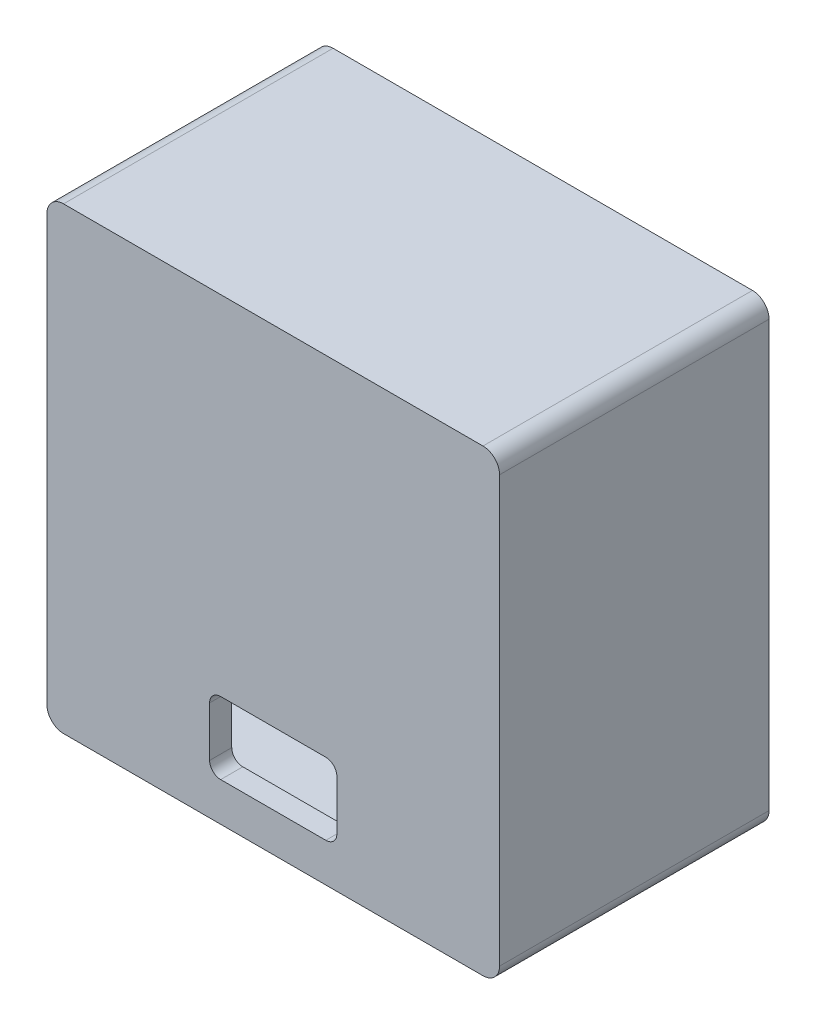
ISO-10303-21;
HEADER;
FILE_DESCRIPTION(('STEP AP214'),'2;1');
FILE_NAME('part.step','',(''),(''),'','','');
FILE_SCHEMA(('AUTOMOTIVE_DESIGN { 1 0 10303 214 1 1 1 1 }'));
ENDSEC;
DATA;
#1=APPLICATION_CONTEXT('core data for automotive mechanical design processes');
#2=APPLICATION_PROTOCOL_DEFINITION('international standard','automotive_design',2000,#1);
#3=PRODUCT_CONTEXT('',#1,'mechanical');
#4=PRODUCT('Part','Part','',(#3));
#5=PRODUCT_RELATED_PRODUCT_CATEGORY('part','',(#4));
#6=PRODUCT_DEFINITION_FORMATION('','',#4);
#7=PRODUCT_DEFINITION_CONTEXT('part definition',#1,'design');
#8=PRODUCT_DEFINITION('design','',#6,#7);
#9=PRODUCT_DEFINITION_SHAPE('','',#8);
#10=(LENGTH_UNIT() NAMED_UNIT(*) SI_UNIT(.MILLI.,.METRE.));
#11=(NAMED_UNIT(*) PLANE_ANGLE_UNIT() SI_UNIT($,.RADIAN.));
#12=(NAMED_UNIT(*) SI_UNIT($,.STERADIAN.) SOLID_ANGLE_UNIT());
#13=UNCERTAINTY_MEASURE_WITH_UNIT(LENGTH_MEASURE(1.E-05),#10,'distance_accuracy_value','');
#14=(GEOMETRIC_REPRESENTATION_CONTEXT(3) GLOBAL_UNCERTAINTY_ASSIGNED_CONTEXT((#13)) GLOBAL_UNIT_ASSIGNED_CONTEXT((#10,
#11,#12)) REPRESENTATION_CONTEXT('',''));
#15=CARTESIAN_POINT('',(0.,0.,0.));
#16=DIRECTION('',(0.,0.,1.));
#17=DIRECTION('',(1.,0.,0.));
#18=AXIS2_PLACEMENT_3D('',#15,#16,#17);
#19=CARTESIAN_POINT('',(0.,0.,80.));
#20=DIRECTION('',(0.,0.,1.));
#21=DIRECTION('',(1.,0.,0.));
#22=AXIS2_PLACEMENT_3D('',#19,#20,#21);
#23=PLANE('',#22);
#24=DIRECTION('',(0.,-1.,0.));
#25=VECTOR('',#24,1.);
#26=CARTESIAN_POINT('',(39.0435,38.599,80.));
#27=LINE('',#26,#25);
#28=CARTESIAN_POINT('',(39.0435,38.599,80.));
#29=VERTEX_POINT('',#28);
#30=CARTESIAN_POINT('',(39.0435,-38.599,80.));
#31=VERTEX_POINT('',#30);
#32=EDGE_CURVE('E240',#29,#31,#27,.T.);
#33=ORIENTED_EDGE('',*,*,#32,.F.);
#34=DIRECTION('',(1.,0.,0.));
#35=VECTOR('',#34,1.);
#36=CARTESIAN_POINT('',(-39.0435,38.599,80.));
#37=LINE('',#36,#35);
#38=CARTESIAN_POINT('',(-39.0435,38.599,80.));
#39=VERTEX_POINT('',#38);
#40=EDGE_CURVE('E211',#39,#29,#37,.T.);
#41=ORIENTED_EDGE('',*,*,#40,.F.);
#42=DIRECTION('',(0.,1.,0.));
#43=VECTOR('',#42,1.);
#44=CARTESIAN_POINT('',(-39.0435,-38.599,80.));
#45=LINE('',#44,#43);
#46=CARTESIAN_POINT('',(-39.0435,-38.599,80.));
#47=VERTEX_POINT('',#46);
#48=EDGE_CURVE('E228',#47,#39,#45,.T.);
#49=ORIENTED_EDGE('',*,*,#48,.F.);
#50=DIRECTION('',(-1.,0.,0.));
#51=VECTOR('',#50,1.);
#52=CARTESIAN_POINT('',(39.0435,-38.599,80.));
#53=LINE('',#52,#51);
#54=EDGE_CURVE('E231',#31,#47,#53,.T.);
#55=ORIENTED_EDGE('',*,*,#54,.F.);
#56=EDGE_LOOP('',(#33,#41,#49,#55));
#57=FACE_BOUND('',#56,.T.);
#58=CARTESIAN_POINT('',(-37.8935,37.449,80.));
#59=DIRECTION('',(0.,0.,1.));
#60=DIRECTION('',(1.,0.,0.));
#61=AXIS2_PLACEMENT_3D('',#58,#59,#60);
#62=CIRCLE('',#61,3.);
#63=CARTESIAN_POINT('',(-40.8935,37.449,80.));
#64=VERTEX_POINT('',#63);
#65=CARTESIAN_POINT('',(-37.8935,40.449,80.));
#66=VERTEX_POINT('',#65);
#67=EDGE_CURVE('E343',#64,#66,#62,.F.);
#68=ORIENTED_EDGE('',*,*,#67,.T.);
#69=DIRECTION('',(-1.,0.,0.));
#70=VECTOR('',#69,1.);
#71=CARTESIAN_POINT('',(-36.8935,40.449,80.));
#72=LINE('',#71,#70);
#73=CARTESIAN_POINT('',(37.8935,40.449,80.));
#74=VERTEX_POINT('',#73);
#75=EDGE_CURVE('E344',#74,#66,#72,.T.);
#76=ORIENTED_EDGE('',*,*,#75,.F.);
#77=CARTESIAN_POINT('',(37.8935,37.449,80.));
#78=DIRECTION('',(0.,0.,1.));
#79=DIRECTION('',(1.,0.,0.));
#80=AXIS2_PLACEMENT_3D('',#77,#78,#79);
#81=CIRCLE('',#80,3.);
#82=CARTESIAN_POINT('',(40.8935,37.449,80.));
#83=VERTEX_POINT('',#82);
#84=EDGE_CURVE('E339',#74,#83,#81,.F.);
#85=ORIENTED_EDGE('',*,*,#84,.T.);
#86=DIRECTION('',(0.,1.,0.));
#87=VECTOR('',#86,1.);
#88=CARTESIAN_POINT('',(40.8935,36.449,80.));
#89=LINE('',#88,#87);
#90=CARTESIAN_POINT('',(40.8935,-39.449,80.));
#91=VERTEX_POINT('',#90);
#92=EDGE_CURVE('E334',#91,#83,#89,.T.);
#93=ORIENTED_EDGE('',*,*,#92,.F.);
#94=CARTESIAN_POINT('',(37.8935,-39.449,80.));
#95=DIRECTION('',(0.,0.,1.));
#96=DIRECTION('',(1.,0.,0.));
#97=AXIS2_PLACEMENT_3D('',#94,#95,#96);
#98=CIRCLE('',#97,3.);
#99=CARTESIAN_POINT('',(37.8935,-42.449,80.));
#100=VERTEX_POINT('',#99);
#101=EDGE_CURVE('E335',#91,#100,#98,.F.);
#102=ORIENTED_EDGE('',*,*,#101,.T.);
#103=DIRECTION('',(-1.,0.,0.));
#104=VECTOR('',#103,1.);
#105=CARTESIAN_POINT('',(0.,-42.449,80.));
#106=LINE('',#105,#104);
#107=CARTESIAN_POINT('',(-37.8935,-42.449,80.));
#108=VERTEX_POINT('',#107);
#109=EDGE_CURVE('E340',#100,#108,#106,.T.);
#110=ORIENTED_EDGE('',*,*,#109,.T.);
#111=CARTESIAN_POINT('',(-37.8935,-39.449,80.));
#112=DIRECTION('',(0.,0.,1.));
#113=DIRECTION('',(1.,0.,0.));
#114=AXIS2_PLACEMENT_3D('',#111,#112,#113);
#115=CIRCLE('',#114,3.);
#116=CARTESIAN_POINT('',(-40.8935,-39.449,80.));
#117=VERTEX_POINT('',#116);
#118=EDGE_CURVE('E349',#108,#117,#115,.F.);
#119=ORIENTED_EDGE('',*,*,#118,.T.);
#120=DIRECTION('',(0.,-1.,0.));
#121=VECTOR('',#120,1.);
#122=CARTESIAN_POINT('',(-40.8935,36.449,80.));
#123=LINE('',#122,#121);
#124=EDGE_CURVE('E346',#64,#117,#123,.T.);
#125=ORIENTED_EDGE('',*,*,#124,.F.);
#126=EDGE_LOOP('',(#68,#76,#85,#93,#102,#110,#119,#125));
#127=FACE_BOUND('',#126,.T.);
#128=ADVANCED_FACE('F43',(#57,#127),#23,.F.);
#129=CARTESIAN_POINT('',(-36.8935,40.449,123.698));
#130=DIRECTION('',(0.,-1.,0.));
#131=DIRECTION('',(0.,0.,-1.));
#132=AXIS2_PLACEMENT_3D('',#129,#130,#131);
#133=PLANE('',#132);
#134=DIRECTION('',(0.,0.,-1.));
#135=VECTOR('',#134,1.);
#136=CARTESIAN_POINT('',(37.8935,40.449,123.698));
#137=LINE('',#136,#135);
#138=CARTESIAN_POINT('',(37.8935,40.449,128.698));
#139=VERTEX_POINT('',#138);
#140=EDGE_CURVE('E311',#139,#74,#137,.T.);
#141=ORIENTED_EDGE('',*,*,#140,.T.);
#142=ORIENTED_EDGE('',*,*,#75,.T.);
#143=DIRECTION('',(0.,0.,-1.));
#144=VECTOR('',#143,1.);
#145=CARTESIAN_POINT('',(-37.8935,40.449,123.698));
#146=LINE('',#145,#144);
#147=CARTESIAN_POINT('',(-37.8935,40.449,128.698));
#148=VERTEX_POINT('',#147);
#149=EDGE_CURVE('E314',#66,#148,#146,.F.);
#150=ORIENTED_EDGE('',*,*,#149,.T.);
#151=DIRECTION('',(-1.,0.,0.));
#152=VECTOR('',#151,1.);
#153=CARTESIAN_POINT('',(40.8935,40.449,128.698));
#154=LINE('',#153,#152);
#155=EDGE_CURVE('E276',#139,#148,#154,.T.);
#156=ORIENTED_EDGE('',*,*,#155,.F.);
#157=EDGE_LOOP('',(#141,#142,#150,#156));
#158=FACE_BOUND('',#157,.T.);
#159=ADVANCED_FACE('F451',(#158),#133,.F.);
#160=CARTESIAN_POINT('',(-40.8935,36.449,123.698));
#161=DIRECTION('',(1.,0.,0.));
#162=DIRECTION('',(0.,1.,0.));
#163=AXIS2_PLACEMENT_3D('',#160,#161,#162);
#164=PLANE('',#163);
#165=DIRECTION('',(0.,0.,-1.));
#166=VECTOR('',#165,1.);
#167=CARTESIAN_POINT('',(-40.8935,37.449,123.698));
#168=LINE('',#167,#166);
#169=CARTESIAN_POINT('',(-40.8935,37.449,128.698));
#170=VERTEX_POINT('',#169);
#171=EDGE_CURVE('E308',#170,#64,#168,.T.);
#172=ORIENTED_EDGE('',*,*,#171,.T.);
#173=ORIENTED_EDGE('',*,*,#124,.T.);
#174=DIRECTION('',(0.,0.,-1.));
#175=VECTOR('',#174,1.);
#176=CARTESIAN_POINT('',(-40.8935,-39.449,128.698));
#177=LINE('',#176,#175);
#178=CARTESIAN_POINT('',(-40.8935,-39.449,128.698));
#179=VERTEX_POINT('',#178);
#180=EDGE_CURVE('E306',#117,#179,#177,.F.);
#181=ORIENTED_EDGE('',*,*,#180,.T.);
#182=DIRECTION('',(0.,-1.,0.));
#183=VECTOR('',#182,1.);
#184=CARTESIAN_POINT('',(-40.8935,40.449,128.698));
#185=LINE('',#184,#183);
#186=EDGE_CURVE('E279',#170,#179,#185,.T.);
#187=ORIENTED_EDGE('',*,*,#186,.F.);
#188=EDGE_LOOP('',(#172,#173,#181,#187));
#189=FACE_BOUND('',#188,.T.);
#190=ADVANCED_FACE('F460',(#189),#164,.F.);
#191=CARTESIAN_POINT('',(40.8935,36.449,123.698));
#192=DIRECTION('',(-1.,0.,0.));
#193=DIRECTION('',(0.,0.,1.));
#194=AXIS2_PLACEMENT_3D('',#191,#192,#193);
#195=PLANE('',#194);
#196=DIRECTION('',(0.,0.,1.));
#197=VECTOR('',#196,1.);
#198=CARTESIAN_POINT('',(40.8935,-39.449,-4.));
#199=LINE('',#198,#197);
#200=CARTESIAN_POINT('',(40.8935,-39.449,128.698));
#201=VERTEX_POINT('',#200);
#202=EDGE_CURVE('E329',#201,#91,#199,.F.);
#203=ORIENTED_EDGE('',*,*,#202,.T.);
#204=ORIENTED_EDGE('',*,*,#92,.T.);
#205=DIRECTION('',(0.,0.,-1.));
#206=VECTOR('',#205,1.);
#207=CARTESIAN_POINT('',(40.8935,37.449,123.698));
#208=LINE('',#207,#206);
#209=CARTESIAN_POINT('',(40.8935,37.449,128.698));
#210=VERTEX_POINT('',#209);
#211=EDGE_CURVE('E332',#83,#210,#208,.F.);
#212=ORIENTED_EDGE('',*,*,#211,.T.);
#213=DIRECTION('',(0.,1.,0.));
#214=VECTOR('',#213,1.);
#215=CARTESIAN_POINT('',(40.8935,-40.449,128.698));
#216=LINE('',#215,#214);
#217=EDGE_CURVE('E273',#201,#210,#216,.T.);
#218=ORIENTED_EDGE('',*,*,#217,.F.);
#219=EDGE_LOOP('',(#203,#204,#212,#218));
#220=FACE_BOUND('',#219,.T.);
#221=ADVANCED_FACE('F487',(#220),#195,.F.);
#222=CARTESIAN_POINT('',(0.,0.,128.698));
#223=DIRECTION('',(0.,0.,1.));
#224=DIRECTION('',(1.,0.,0.));
#225=AXIS2_PLACEMENT_3D('',#222,#223,#224);
#226=PLANE('',#225);
#227=DIRECTION('',(0.,1.,0.));
#228=VECTOR('',#227,1.);
#229=CARTESIAN_POINT('',(11.5,-22.449,128.698));
#230=LINE('',#229,#228);
#231=CARTESIAN_POINT('',(11.5,-33.449,128.698));
#232=VERTEX_POINT('',#231);
#233=CARTESIAN_POINT('',(11.5,-24.449,128.698));
#234=VERTEX_POINT('',#233);
#235=EDGE_CURVE('E425',#232,#234,#230,.T.);
#236=ORIENTED_EDGE('',*,*,#235,.F.);
#237=CARTESIAN_POINT('',(9.50000000000001,-33.449,128.698));
#238=DIRECTION('',(0.,0.,1.));
#239=DIRECTION('',(1.,0.,0.));
#240=AXIS2_PLACEMENT_3D('',#237,#238,#239);
#241=CIRCLE('',#240,2.);
#242=CARTESIAN_POINT('',(9.50000000000001,-35.449,128.698));
#243=VERTEX_POINT('',#242);
#244=EDGE_CURVE('E395',#232,#243,#241,.F.);
#245=ORIENTED_EDGE('',*,*,#244,.T.);
#246=DIRECTION('',(1.,0.,0.));
#247=VECTOR('',#246,1.);
#248=CARTESIAN_POINT('',(-11.5,-35.449,128.698));
#249=LINE('',#248,#247);
#250=CARTESIAN_POINT('',(-9.49999999999999,-35.449,128.698));
#251=VERTEX_POINT('',#250);
#252=EDGE_CURVE('E234',#251,#243,#249,.T.);
#253=ORIENTED_EDGE('',*,*,#252,.F.);
#254=CARTESIAN_POINT('',(-9.49999999999999,-33.449,128.698));
#255=DIRECTION('',(0.,0.,1.));
#256=DIRECTION('',(1.,0.,0.));
#257=AXIS2_PLACEMENT_3D('',#254,#255,#256);
#258=CIRCLE('',#257,2.);
#259=CARTESIAN_POINT('',(-11.5,-33.449,128.698));
#260=VERTEX_POINT('',#259);
#261=EDGE_CURVE('E51',#251,#260,#258,.F.);
#262=ORIENTED_EDGE('',*,*,#261,.T.);
#263=DIRECTION('',(0.,-1.,0.));
#264=VECTOR('',#263,1.);
#265=CARTESIAN_POINT('',(-11.5,-22.449,128.698));
#266=LINE('',#265,#264);
#267=CARTESIAN_POINT('',(-11.5,-24.449,128.698));
#268=VERTEX_POINT('',#267);
#269=EDGE_CURVE('E405',#268,#260,#266,.T.);
#270=ORIENTED_EDGE('',*,*,#269,.F.);
#271=CARTESIAN_POINT('',(-9.49999999999999,-24.449,128.698));
#272=DIRECTION('',(0.,0.,1.));
#273=DIRECTION('',(1.,0.,0.));
#274=AXIS2_PLACEMENT_3D('',#271,#272,#273);
#275=CIRCLE('',#274,2.);
#276=CARTESIAN_POINT('',(-9.49999999999999,-22.449,128.698));
#277=VERTEX_POINT('',#276);
#278=EDGE_CURVE('E387',#268,#277,#275,.F.);
#279=ORIENTED_EDGE('',*,*,#278,.T.);
#280=DIRECTION('',(-1.,0.,0.));
#281=VECTOR('',#280,1.);
#282=CARTESIAN_POINT('',(-11.5,-22.449,128.698));
#283=LINE('',#282,#281);
#284=CARTESIAN_POINT('',(9.50000000000001,-22.449,128.698));
#285=VERTEX_POINT('',#284);
#286=EDGE_CURVE('E413',#285,#277,#283,.T.);
#287=ORIENTED_EDGE('',*,*,#286,.F.);
#288=CARTESIAN_POINT('',(9.50000000000001,-24.449,128.698));
#289=DIRECTION('',(0.,0.,1.));
#290=DIRECTION('',(1.,0.,0.));
#291=AXIS2_PLACEMENT_3D('',#288,#289,#290);
#292=CIRCLE('',#291,2.);
#293=EDGE_CURVE('E391',#285,#234,#292,.F.);
#294=ORIENTED_EDGE('',*,*,#293,.T.);
#295=EDGE_LOOP('',(#236,#245,#253,#262,#270,#279,#287,#294));
#296=FACE_BOUND('',#295,.T.);
#297=ORIENTED_EDGE('',*,*,#155,.T.);
#298=CARTESIAN_POINT('',(-37.8935,37.449,128.698));
#299=DIRECTION('',(0.,0.,1.));
#300=DIRECTION('',(1.,0.,0.));
#301=AXIS2_PLACEMENT_3D('',#298,#299,#300);
#302=CIRCLE('',#301,3.);
#303=EDGE_CURVE('E322',#148,#170,#302,.T.);
#304=ORIENTED_EDGE('',*,*,#303,.T.);
#305=ORIENTED_EDGE('',*,*,#186,.T.);
#306=CARTESIAN_POINT('',(-37.8935,-39.449,128.698));
#307=DIRECTION('',(0.,0.,1.));
#308=DIRECTION('',(1.,0.,0.));
#309=AXIS2_PLACEMENT_3D('',#306,#307,#308);
#310=CIRCLE('',#309,3.);
#311=CARTESIAN_POINT('',(-37.8935,-42.449,128.698));
#312=VERTEX_POINT('',#311);
#313=EDGE_CURVE('E320',#179,#312,#310,.T.);
#314=ORIENTED_EDGE('',*,*,#313,.T.);
#315=DIRECTION('',(-1.,0.,0.));
#316=VECTOR('',#315,1.);
#317=CARTESIAN_POINT('',(40.8935,-42.449,128.698));
#318=LINE('',#317,#316);
#319=CARTESIAN_POINT('',(37.8935,-42.449,128.698));
#320=VERTEX_POINT('',#319);
#321=EDGE_CURVE('E268',#320,#312,#318,.T.);
#322=ORIENTED_EDGE('',*,*,#321,.F.);
#323=CARTESIAN_POINT('',(37.8935,-39.449,128.698));
#324=DIRECTION('',(0.,0.,1.));
#325=DIRECTION('',(1.,0.,0.));
#326=AXIS2_PLACEMENT_3D('',#323,#324,#325);
#327=CIRCLE('',#326,3.);
#328=EDGE_CURVE('E316',#320,#201,#327,.T.);
#329=ORIENTED_EDGE('',*,*,#328,.T.);
#330=ORIENTED_EDGE('',*,*,#217,.T.);
#331=CARTESIAN_POINT('',(37.8935,37.449,128.698));
#332=DIRECTION('',(0.,0.,1.));
#333=DIRECTION('',(1.,0.,0.));
#334=AXIS2_PLACEMENT_3D('',#331,#332,#333);
#335=CIRCLE('',#334,3.);
#336=EDGE_CURVE('E318',#210,#139,#335,.T.);
#337=ORIENTED_EDGE('',*,*,#336,.T.);
#338=EDGE_LOOP('',(#297,#304,#305,#314,#322,#329,#330,#337));
#339=FACE_BOUND('',#338,.T.);
#340=ADVANCED_FACE('F403',(#296,#339),#226,.T.);
#341=CARTESIAN_POINT('',(0.,-42.449,0.));
#342=DIRECTION('',(0.,-1.,0.));
#343=DIRECTION('',(1.,0.,0.));
#344=AXIS2_PLACEMENT_3D('',#341,#342,#343);
#345=PLANE('',#344);
#346=ORIENTED_EDGE('',*,*,#109,.F.);
#347=DIRECTION('',(0.,0.,1.));
#348=VECTOR('',#347,1.);
#349=CARTESIAN_POINT('',(37.8935,-42.449,128.698));
#350=LINE('',#349,#348);
#351=EDGE_CURVE('E324',#100,#320,#350,.T.);
#352=ORIENTED_EDGE('',*,*,#351,.T.);
#353=ORIENTED_EDGE('',*,*,#321,.T.);
#354=DIRECTION('',(0.,0.,-1.));
#355=VECTOR('',#354,1.);
#356=CARTESIAN_POINT('',(-37.8935,-42.449,-4.));
#357=LINE('',#356,#355);
#358=EDGE_CURVE('E326',#312,#108,#357,.T.);
#359=ORIENTED_EDGE('',*,*,#358,.T.);
#360=EDGE_LOOP('',(#346,#352,#353,#359));
#361=FACE_BOUND('',#360,.T.);
#362=CARTESIAN_POINT('',(22.225,-42.449,109.648));
#363=DIRECTION('',(0.,-1.,0.));
#364=DIRECTION('',(1.,0.,0.));
#365=AXIS2_PLACEMENT_3D('',#362,#363,#364);
#366=CIRCLE('',#365,3.025);
#367=CARTESIAN_POINT('',(25.25,-42.449,109.648));
#368=VERTEX_POINT('',#367);
#369=EDGE_CURVE('E259',#368,#368,#366,.T.);
#370=ORIENTED_EDGE('',*,*,#369,.F.);
#371=EDGE_LOOP('',(#370));
#372=FACE_BOUND('',#371,.T.);
#373=CARTESIAN_POINT('',(-22.225,-42.449,109.648));
#374=DIRECTION('',(0.,-1.,0.));
#375=DIRECTION('',(1.,0.,0.));
#376=AXIS2_PLACEMENT_3D('',#373,#374,#375);
#377=CIRCLE('',#376,3.025);
#378=CARTESIAN_POINT('',(-19.2,-42.449,109.648));
#379=VERTEX_POINT('',#378);
#380=EDGE_CURVE('E262',#379,#379,#377,.T.);
#381=ORIENTED_EDGE('',*,*,#380,.F.);
#382=EDGE_LOOP('',(#381));
#383=FACE_BOUND('',#382,.T.);
#384=ADVANCED_FACE('F514',(#361,#372,#383),#345,.T.);
#385=CARTESIAN_POINT('',(-22.225,-37.449,109.648));
#386=DIRECTION('',(0.,-1.,0.));
#387=DIRECTION('',(1.,0.,0.));
#388=AXIS2_PLACEMENT_3D('',#385,#386,#387);
#389=CYLINDRICAL_SURFACE('',#388,3.025);
#390=CARTESIAN_POINT('',(-22.225,-37.449,109.648));
#391=DIRECTION('',(0.,-1.,0.));
#392=DIRECTION('',(1.,0.,0.));
#393=AXIS2_PLACEMENT_3D('',#390,#391,#392);
#394=CIRCLE('',#393,3.025);
#395=CARTESIAN_POINT('',(-19.2,-37.449,109.648));
#396=VERTEX_POINT('',#395);
#397=EDGE_CURVE('E265',#396,#396,#394,.T.);
#398=ORIENTED_EDGE('',*,*,#397,.F.);
#399=EDGE_LOOP('',(#398));
#400=FACE_BOUND('',#399,.T.);
#401=ORIENTED_EDGE('',*,*,#380,.T.);
#402=EDGE_LOOP('',(#401));
#403=FACE_BOUND('',#402,.T.);
#404=ADVANCED_FACE('F517',(#400,#403),#389,.F.);
#405=CARTESIAN_POINT('',(-22.225,-37.449,109.648));
#406=DIRECTION('',(0.,-1.,0.));
#407=DIRECTION('',(1.,0.,0.));
#408=AXIS2_PLACEMENT_3D('',#405,#406,#407);
#409=PLANE('',#408);
#410=ORIENTED_EDGE('',*,*,#397,.T.);
#411=EDGE_LOOP('',(#410));
#412=FACE_BOUND('',#411,.T.);
#413=ADVANCED_FACE('F521',(#412),#409,.T.);
#414=CARTESIAN_POINT('',(22.225,-37.449,109.648));
#415=DIRECTION('',(0.,-1.,0.));
#416=DIRECTION('',(1.,0.,0.));
#417=AXIS2_PLACEMENT_3D('',#414,#415,#416);
#418=CYLINDRICAL_SURFACE('',#417,3.025);
#419=CARTESIAN_POINT('',(22.225,-37.449,109.648));
#420=DIRECTION('',(0.,-1.,0.));
#421=DIRECTION('',(1.,0.,0.));
#422=AXIS2_PLACEMENT_3D('',#419,#420,#421);
#423=CIRCLE('',#422,3.025);
#424=CARTESIAN_POINT('',(25.25,-37.449,109.648));
#425=VERTEX_POINT('',#424);
#426=EDGE_CURVE('E258',#425,#425,#423,.T.);
#427=ORIENTED_EDGE('',*,*,#426,.F.);
#428=EDGE_LOOP('',(#427));
#429=FACE_BOUND('',#428,.T.);
#430=ORIENTED_EDGE('',*,*,#369,.T.);
#431=EDGE_LOOP('',(#430));
#432=FACE_BOUND('',#431,.T.);
#433=ADVANCED_FACE('F525',(#429,#432),#418,.F.);
#434=CARTESIAN_POINT('',(22.225,-37.449,109.648));
#435=DIRECTION('',(0.,-1.,0.));
#436=DIRECTION('',(1.,0.,0.));
#437=AXIS2_PLACEMENT_3D('',#434,#435,#436);
#438=PLANE('',#437);
#439=ORIENTED_EDGE('',*,*,#426,.T.);
#440=EDGE_LOOP('',(#439));
#441=FACE_BOUND('',#440,.T.);
#442=ADVANCED_FACE('F485',(#441),#438,.T.);
#443=CARTESIAN_POINT('',(-37.8935,37.449,123.698));
#444=DIRECTION('',(0.,0.,-1.));
#445=DIRECTION('',(-1.,0.,0.));
#446=AXIS2_PLACEMENT_3D('',#443,#444,#445);
#447=CYLINDRICAL_SURFACE('',#446,3.);
#448=ORIENTED_EDGE('',*,*,#67,.F.);
#449=ORIENTED_EDGE('',*,*,#171,.F.);
#450=ORIENTED_EDGE('',*,*,#303,.F.);
#451=ORIENTED_EDGE('',*,*,#149,.F.);
#452=EDGE_LOOP('',(#448,#449,#450,#451));
#453=FACE_BOUND('',#452,.T.);
#454=ADVANCED_FACE('F481',(#453),#447,.T.);
#455=CARTESIAN_POINT('',(-37.8935,-39.449,0.));
#456=DIRECTION('',(0.,0.,1.));
#457=DIRECTION('',(1.,0.,0.));
#458=AXIS2_PLACEMENT_3D('',#455,#456,#457);
#459=CYLINDRICAL_SURFACE('',#458,3.);
#460=ORIENTED_EDGE('',*,*,#118,.F.);
#461=ORIENTED_EDGE('',*,*,#358,.F.);
#462=ORIENTED_EDGE('',*,*,#313,.F.);
#463=ORIENTED_EDGE('',*,*,#180,.F.);
#464=EDGE_LOOP('',(#460,#461,#462,#463));
#465=FACE_BOUND('',#464,.T.);
#466=ADVANCED_FACE('F475',(#465),#459,.T.);
#467=CARTESIAN_POINT('',(37.8935,37.449,123.698));
#468=DIRECTION('',(0.,0.,-1.));
#469=DIRECTION('',(-1.,0.,0.));
#470=AXIS2_PLACEMENT_3D('',#467,#468,#469);
#471=CYLINDRICAL_SURFACE('',#470,3.);
#472=ORIENTED_EDGE('',*,*,#84,.F.);
#473=ORIENTED_EDGE('',*,*,#140,.F.);
#474=ORIENTED_EDGE('',*,*,#336,.F.);
#475=ORIENTED_EDGE('',*,*,#211,.F.);
#476=EDGE_LOOP('',(#472,#473,#474,#475));
#477=FACE_BOUND('',#476,.T.);
#478=ADVANCED_FACE('F466',(#477),#471,.T.);
#479=CARTESIAN_POINT('',(37.8935,-39.449,0.));
#480=DIRECTION('',(0.,0.,-1.));
#481=DIRECTION('',(-1.,0.,0.));
#482=AXIS2_PLACEMENT_3D('',#479,#480,#481);
#483=CYLINDRICAL_SURFACE('',#482,3.);
#484=ORIENTED_EDGE('',*,*,#101,.F.);
#485=ORIENTED_EDGE('',*,*,#202,.F.);
#486=ORIENTED_EDGE('',*,*,#328,.F.);
#487=ORIENTED_EDGE('',*,*,#351,.F.);
#488=EDGE_LOOP('',(#484,#485,#486,#487));
#489=FACE_BOUND('',#488,.T.);
#490=ADVANCED_FACE('F454',(#489),#483,.T.);
#491=CARTESIAN_POINT('',(-39.0435,38.599,101.));
#492=DIRECTION('',(0.,1.,0.));
#493=DIRECTION('',(-1.,0.,0.));
#494=AXIS2_PLACEMENT_3D('',#491,#492,#493);
#495=PLANE('',#494);
#496=ORIENTED_EDGE('',*,*,#40,.T.);
#497=DIRECTION('',(0.,0.,-1.));
#498=VECTOR('',#497,1.);
#499=CARTESIAN_POINT('',(39.0435,38.599,101.));
#500=LINE('',#499,#498);
#501=CARTESIAN_POINT('',(39.0435,38.599,101.));
#502=VERTEX_POINT('',#501);
#503=EDGE_CURVE('E204',#502,#29,#500,.T.);
#504=ORIENTED_EDGE('',*,*,#503,.F.);
#505=DIRECTION('',(1.,0.,0.));
#506=VECTOR('',#505,1.);
#507=CARTESIAN_POINT('',(-39.0435,38.599,101.));
#508=LINE('',#507,#506);
#509=CARTESIAN_POINT('',(-39.0435,38.599,101.));
#510=VERTEX_POINT('',#509);
#511=EDGE_CURVE('E208',#510,#502,#508,.T.);
#512=ORIENTED_EDGE('',*,*,#511,.F.);
#513=DIRECTION('',(0.,0.,-1.));
#514=VECTOR('',#513,1.);
#515=CARTESIAN_POINT('',(-39.0435,38.599,101.));
#516=LINE('',#515,#514);
#517=EDGE_CURVE('E244',#510,#39,#516,.T.);
#518=ORIENTED_EDGE('',*,*,#517,.T.);
#519=EDGE_LOOP('',(#496,#504,#512,#518));
#520=FACE_BOUND('',#519,.T.);
#521=ADVANCED_FACE('F206',(#520),#495,.F.);
#522=CARTESIAN_POINT('',(-39.0435,-38.599,101.));
#523=DIRECTION('',(-1.,0.,0.));
#524=DIRECTION('',(0.,0.,1.));
#525=AXIS2_PLACEMENT_3D('',#522,#523,#524);
#526=PLANE('',#525);
#527=ORIENTED_EDGE('',*,*,#48,.T.);
#528=ORIENTED_EDGE('',*,*,#517,.F.);
#529=DIRECTION('',(0.,1.,0.));
#530=VECTOR('',#529,1.);
#531=CARTESIAN_POINT('',(-39.0435,-38.599,101.));
#532=LINE('',#531,#530);
#533=CARTESIAN_POINT('',(-39.0435,-38.599,101.));
#534=VERTEX_POINT('',#533);
#535=EDGE_CURVE('E216',#534,#510,#532,.T.);
#536=ORIENTED_EDGE('',*,*,#535,.F.);
#537=DIRECTION('',(0.,0.,-1.));
#538=VECTOR('',#537,1.);
#539=CARTESIAN_POINT('',(-39.0435,-38.599,101.));
#540=LINE('',#539,#538);
#541=EDGE_CURVE('E247',#534,#47,#540,.T.);
#542=ORIENTED_EDGE('',*,*,#541,.T.);
#543=EDGE_LOOP('',(#527,#528,#536,#542));
#544=FACE_BOUND('',#543,.T.);
#545=ADVANCED_FACE('F473',(#544),#526,.F.);
#546=CARTESIAN_POINT('',(39.0435,-38.599,101.));
#547=DIRECTION('',(0.,-1.,0.));
#548=DIRECTION('',(1.,0.,0.));
#549=AXIS2_PLACEMENT_3D('',#546,#547,#548);
#550=PLANE('',#549);
#551=ORIENTED_EDGE('',*,*,#54,.T.);
#552=ORIENTED_EDGE('',*,*,#541,.F.);
#553=DIRECTION('',(-1.,0.,0.));
#554=VECTOR('',#553,1.);
#555=CARTESIAN_POINT('',(39.0435,-38.599,101.));
#556=LINE('',#555,#554);
#557=CARTESIAN_POINT('',(39.0435,-38.599,101.));
#558=VERTEX_POINT('',#557);
#559=EDGE_CURVE('E224',#558,#534,#556,.T.);
#560=ORIENTED_EDGE('',*,*,#559,.F.);
#561=DIRECTION('',(0.,0.,-1.));
#562=VECTOR('',#561,1.);
#563=CARTESIAN_POINT('',(39.0435,-38.599,101.));
#564=LINE('',#563,#562);
#565=EDGE_CURVE('E215',#558,#31,#564,.T.);
#566=ORIENTED_EDGE('',*,*,#565,.T.);
#567=EDGE_LOOP('',(#551,#552,#560,#566));
#568=FACE_BOUND('',#567,.T.);
#569=ADVANCED_FACE('F535',(#568),#550,.F.);
#570=CARTESIAN_POINT('',(39.0435,38.599,101.));
#571=DIRECTION('',(1.,0.,0.));
#572=DIRECTION('',(0.,1.,0.));
#573=AXIS2_PLACEMENT_3D('',#570,#571,#572);
#574=PLANE('',#573);
#575=ORIENTED_EDGE('',*,*,#32,.T.);
#576=ORIENTED_EDGE('',*,*,#565,.F.);
#577=DIRECTION('',(0.,-1.,0.));
#578=VECTOR('',#577,1.);
#579=CARTESIAN_POINT('',(39.0435,38.599,101.));
#580=LINE('',#579,#578);
#581=EDGE_CURVE('E219',#502,#558,#580,.T.);
#582=ORIENTED_EDGE('',*,*,#581,.F.);
#583=ORIENTED_EDGE('',*,*,#503,.T.);
#584=EDGE_LOOP('',(#575,#576,#582,#583));
#585=FACE_BOUND('',#584,.T.);
#586=ADVANCED_FACE('F220',(#585),#574,.F.);
#587=CARTESIAN_POINT('',(0.,0.,101.));
#588=DIRECTION('',(0.,0.,-1.));
#589=DIRECTION('',(-1.,0.,0.));
#590=AXIS2_PLACEMENT_3D('',#587,#588,#589);
#591=PLANE('',#590);
#592=DIRECTION('',(-1.,0.,0.));
#593=VECTOR('',#592,1.);
#594=CARTESIAN_POINT('',(-36.8935,-36.449,101.));
#595=LINE('',#594,#593);
#596=CARTESIAN_POINT('',(36.8935,-36.449,101.));
#597=VERTEX_POINT('',#596);
#598=CARTESIAN_POINT('',(-36.8935,-36.449,101.));
#599=VERTEX_POINT('',#598);
#600=EDGE_CURVE('E252',#597,#599,#595,.T.);
#601=ORIENTED_EDGE('',*,*,#600,.F.);
#602=DIRECTION('',(0.,-1.,0.));
#603=VECTOR('',#602,1.);
#604=CARTESIAN_POINT('',(36.8935,36.449,101.));
#605=LINE('',#604,#603);
#606=CARTESIAN_POINT('',(36.8935,36.449,101.));
#607=VERTEX_POINT('',#606);
#608=EDGE_CURVE('E246',#607,#597,#605,.T.);
#609=ORIENTED_EDGE('',*,*,#608,.F.);
#610=DIRECTION('',(1.,0.,0.));
#611=VECTOR('',#610,1.);
#612=CARTESIAN_POINT('',(-36.8935,36.449,101.));
#613=LINE('',#612,#611);
#614=CARTESIAN_POINT('',(-36.8935,36.449,101.));
#615=VERTEX_POINT('',#614);
#616=EDGE_CURVE('E338',#615,#607,#613,.T.);
#617=ORIENTED_EDGE('',*,*,#616,.F.);
#618=DIRECTION('',(0.,1.,0.));
#619=VECTOR('',#618,1.);
#620=CARTESIAN_POINT('',(-36.8935,36.449,101.));
#621=LINE('',#620,#619);
#622=EDGE_CURVE('E255',#599,#615,#621,.T.);
#623=ORIENTED_EDGE('',*,*,#622,.F.);
#624=EDGE_LOOP('',(#601,#609,#617,#623));
#625=FACE_BOUND('',#624,.T.);
#626=ORIENTED_EDGE('',*,*,#511,.T.);
#627=ORIENTED_EDGE('',*,*,#581,.T.);
#628=ORIENTED_EDGE('',*,*,#559,.T.);
#629=ORIENTED_EDGE('',*,*,#535,.T.);
#630=EDGE_LOOP('',(#626,#627,#628,#629));
#631=FACE_BOUND('',#630,.T.);
#632=ADVANCED_FACE('F226',(#625,#631),#591,.T.);
#633=CARTESIAN_POINT('',(0.,0.,124.698));
#634=DIRECTION('',(0.,0.,1.));
#635=DIRECTION('',(1.,0.,0.));
#636=AXIS2_PLACEMENT_3D('',#633,#634,#635);
#637=PLANE('',#636);
#638=DIRECTION('',(0.,-1.,0.));
#639=VECTOR('',#638,1.);
#640=CARTESIAN_POINT('',(-11.5,0.,124.698));
#641=LINE('',#640,#639);
#642=CARTESIAN_POINT('',(-11.5,-24.449,124.698));
#643=VERTEX_POINT('',#642);
#644=CARTESIAN_POINT('',(-11.5,-33.449,124.698));
#645=VERTEX_POINT('',#644);
#646=EDGE_CURVE('E361',#643,#645,#641,.T.);
#647=ORIENTED_EDGE('',*,*,#646,.T.);
#648=CARTESIAN_POINT('',(-9.49999999999999,-33.449,124.698));
#649=DIRECTION('',(0.,0.,1.));
#650=DIRECTION('',(1.,0.,0.));
#651=AXIS2_PLACEMENT_3D('',#648,#649,#650);
#652=CIRCLE('',#651,2.);
#653=CARTESIAN_POINT('',(-9.49999999999999,-35.449,124.698));
#654=VERTEX_POINT('',#653);
#655=EDGE_CURVE('E11',#645,#654,#652,.T.);
#656=ORIENTED_EDGE('',*,*,#655,.T.);
#657=DIRECTION('',(1.,0.,0.));
#658=VECTOR('',#657,1.);
#659=CARTESIAN_POINT('',(0.,-35.449,124.698));
#660=LINE('',#659,#658);
#661=CARTESIAN_POINT('',(9.50000000000001,-35.449,124.698));
#662=VERTEX_POINT('',#661);
#663=EDGE_CURVE('E363',#654,#662,#660,.T.);
#664=ORIENTED_EDGE('',*,*,#663,.T.);
#665=CARTESIAN_POINT('',(9.50000000000001,-33.449,124.698));
#666=DIRECTION('',(0.,0.,1.));
#667=DIRECTION('',(1.,0.,0.));
#668=AXIS2_PLACEMENT_3D('',#665,#666,#667);
#669=CIRCLE('',#668,2.);
#670=CARTESIAN_POINT('',(11.5,-33.449,124.698));
#671=VERTEX_POINT('',#670);
#672=EDGE_CURVE('E397',#662,#671,#669,.T.);
#673=ORIENTED_EDGE('',*,*,#672,.T.);
#674=DIRECTION('',(0.,1.,0.));
#675=VECTOR('',#674,1.);
#676=CARTESIAN_POINT('',(11.5,0.,124.698));
#677=LINE('',#676,#675);
#678=CARTESIAN_POINT('',(11.5,-24.449,124.698));
#679=VERTEX_POINT('',#678);
#680=EDGE_CURVE('E365',#671,#679,#677,.T.);
#681=ORIENTED_EDGE('',*,*,#680,.T.);
#682=CARTESIAN_POINT('',(9.50000000000001,-24.449,124.698));
#683=DIRECTION('',(0.,0.,1.));
#684=DIRECTION('',(1.,0.,0.));
#685=AXIS2_PLACEMENT_3D('',#682,#683,#684);
#686=CIRCLE('',#685,2.);
#687=CARTESIAN_POINT('',(9.50000000000001,-22.449,124.698));
#688=VERTEX_POINT('',#687);
#689=EDGE_CURVE('E393',#679,#688,#686,.T.);
#690=ORIENTED_EDGE('',*,*,#689,.T.);
#691=DIRECTION('',(-1.,0.,0.));
#692=VECTOR('',#691,1.);
#693=CARTESIAN_POINT('',(0.,-22.449,124.698));
#694=LINE('',#693,#692);
#695=CARTESIAN_POINT('',(-9.49999999999999,-22.449,124.698));
#696=VERTEX_POINT('',#695);
#697=EDGE_CURVE('E358',#688,#696,#694,.T.);
#698=ORIENTED_EDGE('',*,*,#697,.T.);
#699=CARTESIAN_POINT('',(-9.49999999999999,-24.449,124.698));
#700=DIRECTION('',(0.,0.,1.));
#701=DIRECTION('',(1.,0.,0.));
#702=AXIS2_PLACEMENT_3D('',#699,#700,#701);
#703=CIRCLE('',#702,2.);
#704=EDGE_CURVE('E389',#696,#643,#703,.T.);
#705=ORIENTED_EDGE('',*,*,#704,.T.);
#706=EDGE_LOOP('',(#647,#656,#664,#673,#681,#690,#698,#705));
#707=FACE_BOUND('',#706,.T.);
#708=DIRECTION('',(-1.,0.,0.));
#709=VECTOR('',#708,1.);
#710=CARTESIAN_POINT('',(36.8935,36.449,124.698));
#711=LINE('',#710,#709);
#712=CARTESIAN_POINT('',(36.8935,36.449,124.698));
#713=VERTEX_POINT('',#712);
#714=CARTESIAN_POINT('',(-36.8935,36.449,124.698));
#715=VERTEX_POINT('',#714);
#716=EDGE_CURVE('E285',#713,#715,#711,.T.);
#717=ORIENTED_EDGE('',*,*,#716,.F.);
#718=DIRECTION('',(0.,1.,0.));
#719=VECTOR('',#718,1.);
#720=CARTESIAN_POINT('',(36.8935,-36.449,124.698));
#721=LINE('',#720,#719);
#722=CARTESIAN_POINT('',(36.8935,-36.449,124.698));
#723=VERTEX_POINT('',#722);
#724=EDGE_CURVE('E282',#723,#713,#721,.T.);
#725=ORIENTED_EDGE('',*,*,#724,.F.);
#726=DIRECTION('',(1.,0.,0.));
#727=VECTOR('',#726,1.);
#728=CARTESIAN_POINT('',(-36.8935,-36.449,124.698));
#729=LINE('',#728,#727);
#730=CARTESIAN_POINT('',(-36.8935,-36.449,124.698));
#731=VERTEX_POINT('',#730);
#732=EDGE_CURVE('E291',#731,#723,#729,.T.);
#733=ORIENTED_EDGE('',*,*,#732,.F.);
#734=DIRECTION('',(0.,-1.,0.));
#735=VECTOR('',#734,1.);
#736=CARTESIAN_POINT('',(-36.8935,36.449,124.698));
#737=LINE('',#736,#735);
#738=EDGE_CURVE('E288',#715,#731,#737,.T.);
#739=ORIENTED_EDGE('',*,*,#738,.F.);
#740=EDGE_LOOP('',(#717,#725,#733,#739));
#741=FACE_BOUND('',#740,.T.);
#742=ADVANCED_FACE('F416',(#707,#741),#637,.F.);
#743=CARTESIAN_POINT('',(-36.8935,36.449,123.698));
#744=DIRECTION('',(0.,-1.,0.));
#745=DIRECTION('',(0.,0.,-1.));
#746=AXIS2_PLACEMENT_3D('',#743,#744,#745);
#747=PLANE('',#746);
#748=DIRECTION('',(0.,0.,-1.));
#749=VECTOR('',#748,1.);
#750=CARTESIAN_POINT('',(-36.8935,36.449,123.698));
#751=LINE('',#750,#749);
#752=EDGE_CURVE('E303',#715,#615,#751,.T.);
#753=ORIENTED_EDGE('',*,*,#752,.T.);
#754=ORIENTED_EDGE('',*,*,#616,.T.);
#755=DIRECTION('',(0.,0.,-1.));
#756=VECTOR('',#755,1.);
#757=CARTESIAN_POINT('',(36.8935,36.449,123.698));
#758=LINE('',#757,#756);
#759=EDGE_CURVE('E294',#713,#607,#758,.T.);
#760=ORIENTED_EDGE('',*,*,#759,.F.);
#761=ORIENTED_EDGE('',*,*,#716,.T.);
#762=EDGE_LOOP('',(#753,#754,#760,#761));
#763=FACE_BOUND('',#762,.T.);
#764=ADVANCED_FACE('F494',(#763),#747,.T.);
#765=CARTESIAN_POINT('',(36.8935,36.449,123.698));
#766=DIRECTION('',(-1.,0.,0.));
#767=DIRECTION('',(0.,0.,1.));
#768=AXIS2_PLACEMENT_3D('',#765,#766,#767);
#769=PLANE('',#768);
#770=ORIENTED_EDGE('',*,*,#759,.T.);
#771=ORIENTED_EDGE('',*,*,#608,.T.);
#772=DIRECTION('',(0.,0.,-1.));
#773=VECTOR('',#772,1.);
#774=CARTESIAN_POINT('',(36.8935,-36.449,123.698));
#775=LINE('',#774,#773);
#776=EDGE_CURVE('E297',#723,#597,#775,.T.);
#777=ORIENTED_EDGE('',*,*,#776,.F.);
#778=ORIENTED_EDGE('',*,*,#724,.T.);
#779=EDGE_LOOP('',(#770,#771,#777,#778));
#780=FACE_BOUND('',#779,.T.);
#781=ADVANCED_FACE('F497',(#780),#769,.T.);
#782=CARTESIAN_POINT('',(-36.8935,-36.449,123.698));
#783=DIRECTION('',(0.,1.,0.));
#784=DIRECTION('',(-1.,0.,0.));
#785=AXIS2_PLACEMENT_3D('',#782,#783,#784);
#786=PLANE('',#785);
#787=ORIENTED_EDGE('',*,*,#776,.T.);
#788=ORIENTED_EDGE('',*,*,#600,.T.);
#789=DIRECTION('',(0.,0.,-1.));
#790=VECTOR('',#789,1.);
#791=CARTESIAN_POINT('',(-36.8935,-36.449,123.698));
#792=LINE('',#791,#790);
#793=EDGE_CURVE('E300',#731,#599,#792,.T.);
#794=ORIENTED_EDGE('',*,*,#793,.F.);
#795=ORIENTED_EDGE('',*,*,#732,.T.);
#796=EDGE_LOOP('',(#787,#788,#794,#795));
#797=FACE_BOUND('',#796,.T.);
#798=ADVANCED_FACE('F502',(#797),#786,.T.);
#799=CARTESIAN_POINT('',(-36.8935,36.449,123.698));
#800=DIRECTION('',(1.,0.,0.));
#801=DIRECTION('',(0.,1.,0.));
#802=AXIS2_PLACEMENT_3D('',#799,#800,#801);
#803=PLANE('',#802);
#804=ORIENTED_EDGE('',*,*,#793,.T.);
#805=ORIENTED_EDGE('',*,*,#622,.T.);
#806=ORIENTED_EDGE('',*,*,#752,.F.);
#807=ORIENTED_EDGE('',*,*,#738,.T.);
#808=EDGE_LOOP('',(#804,#805,#806,#807));
#809=FACE_BOUND('',#808,.T.);
#810=ADVANCED_FACE('F499',(#809),#803,.T.);
#811=CARTESIAN_POINT('',(11.5,-22.449,118.698));
#812=DIRECTION('',(1.,0.,0.));
#813=DIRECTION('',(0.,0.,-1.));
#814=AXIS2_PLACEMENT_3D('',#811,#812,#813);
#815=PLANE('',#814);
#816=ORIENTED_EDGE('',*,*,#235,.T.);
#817=DIRECTION('',(0.,0.,1.));
#818=VECTOR('',#817,1.);
#819=CARTESIAN_POINT('',(11.5,-24.449,124.698));
#820=LINE('',#819,#818);
#821=EDGE_CURVE('E381',#234,#679,#820,.F.);
#822=ORIENTED_EDGE('',*,*,#821,.T.);
#823=ORIENTED_EDGE('',*,*,#680,.F.);
#824=DIRECTION('',(0.,0.,1.));
#825=VECTOR('',#824,1.);
#826=CARTESIAN_POINT('',(11.5,-33.449,128.698));
#827=LINE('',#826,#825);
#828=EDGE_CURVE('E378',#671,#232,#827,.T.);
#829=ORIENTED_EDGE('',*,*,#828,.T.);
#830=EDGE_LOOP('',(#816,#822,#823,#829));
#831=FACE_BOUND('',#830,.T.);
#832=ADVANCED_FACE('F424',(#831),#815,.F.);
#833=CARTESIAN_POINT('',(-11.5,-35.449,118.698));
#834=DIRECTION('',(0.,-1.,0.));
#835=DIRECTION('',(0.,0.,-1.));
#836=AXIS2_PLACEMENT_3D('',#833,#834,#835);
#837=PLANE('',#836);
#838=ORIENTED_EDGE('',*,*,#252,.T.);
#839=DIRECTION('',(0.,0.,1.));
#840=VECTOR('',#839,1.);
#841=CARTESIAN_POINT('',(9.50000000000001,-35.449,124.698));
#842=LINE('',#841,#840);
#843=EDGE_CURVE('E58',#243,#662,#842,.F.);
#844=ORIENTED_EDGE('',*,*,#843,.T.);
#845=ORIENTED_EDGE('',*,*,#663,.F.);
#846=DIRECTION('',(0.,0.,1.));
#847=VECTOR('',#846,1.);
#848=CARTESIAN_POINT('',(-9.49999999999999,-35.449,128.698));
#849=LINE('',#848,#847);
#850=EDGE_CURVE('E383',#654,#251,#849,.T.);
#851=ORIENTED_EDGE('',*,*,#850,.T.);
#852=EDGE_LOOP('',(#838,#844,#845,#851));
#853=FACE_BOUND('',#852,.T.);
#854=ADVANCED_FACE('F414',(#853),#837,.F.);
#855=CARTESIAN_POINT('',(-11.5,-22.449,118.698));
#856=DIRECTION('',(-1.,0.,0.));
#857=DIRECTION('',(0.,-1.,0.));
#858=AXIS2_PLACEMENT_3D('',#855,#856,#857);
#859=PLANE('',#858);
#860=ORIENTED_EDGE('',*,*,#646,.F.);
#861=DIRECTION('',(0.,0.,1.));
#862=VECTOR('',#861,1.);
#863=CARTESIAN_POINT('',(-11.5,-24.449,128.698));
#864=LINE('',#863,#862);
#865=EDGE_CURVE('E370',#643,#268,#864,.T.);
#866=ORIENTED_EDGE('',*,*,#865,.T.);
#867=ORIENTED_EDGE('',*,*,#269,.T.);
#868=DIRECTION('',(0.,0.,1.));
#869=VECTOR('',#868,1.);
#870=CARTESIAN_POINT('',(-11.5,-33.449,124.698));
#871=LINE('',#870,#869);
#872=EDGE_CURVE('E368',#260,#645,#871,.F.);
#873=ORIENTED_EDGE('',*,*,#872,.T.);
#874=EDGE_LOOP('',(#860,#866,#867,#873));
#875=FACE_BOUND('',#874,.T.);
#876=ADVANCED_FACE('F411',(#875),#859,.F.);
#877=CARTESIAN_POINT('',(-11.5,-22.449,118.698));
#878=DIRECTION('',(0.,1.,0.));
#879=DIRECTION('',(0.,0.,1.));
#880=AXIS2_PLACEMENT_3D('',#877,#878,#879);
#881=PLANE('',#880);
#882=ORIENTED_EDGE('',*,*,#286,.T.);
#883=DIRECTION('',(0.,0.,1.));
#884=VECTOR('',#883,1.);
#885=CARTESIAN_POINT('',(-9.49999999999999,-22.449,124.698));
#886=LINE('',#885,#884);
#887=EDGE_CURVE('E376',#277,#696,#886,.F.);
#888=ORIENTED_EDGE('',*,*,#887,.T.);
#889=ORIENTED_EDGE('',*,*,#697,.F.);
#890=DIRECTION('',(0.,0.,1.));
#891=VECTOR('',#890,1.);
#892=CARTESIAN_POINT('',(9.50000000000001,-22.449,128.698));
#893=LINE('',#892,#891);
#894=EDGE_CURVE('E373',#688,#285,#893,.T.);
#895=ORIENTED_EDGE('',*,*,#894,.T.);
#896=EDGE_LOOP('',(#882,#888,#889,#895));
#897=FACE_BOUND('',#896,.T.);
#898=ADVANCED_FACE('F433',(#897),#881,.F.);
#899=CARTESIAN_POINT('',(-9.49999999999999,-24.449,118.698));
#900=DIRECTION('',(0.,0.,-1.));
#901=DIRECTION('',(-1.,0.,0.));
#902=AXIS2_PLACEMENT_3D('',#899,#900,#901);
#903=CYLINDRICAL_SURFACE('',#902,2.);
#904=ORIENTED_EDGE('',*,*,#704,.F.);
#905=ORIENTED_EDGE('',*,*,#887,.F.);
#906=ORIENTED_EDGE('',*,*,#278,.F.);
#907=ORIENTED_EDGE('',*,*,#865,.F.);
#908=EDGE_LOOP('',(#904,#905,#906,#907));
#909=FACE_BOUND('',#908,.T.);
#910=ADVANCED_FACE('F438',(#909),#903,.F.);
#911=CARTESIAN_POINT('',(9.50000000000001,-24.449,118.698));
#912=DIRECTION('',(0.,0.,-1.));
#913=DIRECTION('',(-1.,0.,0.));
#914=AXIS2_PLACEMENT_3D('',#911,#912,#913);
#915=CYLINDRICAL_SURFACE('',#914,2.);
#916=ORIENTED_EDGE('',*,*,#689,.F.);
#917=ORIENTED_EDGE('',*,*,#821,.F.);
#918=ORIENTED_EDGE('',*,*,#293,.F.);
#919=ORIENTED_EDGE('',*,*,#894,.F.);
#920=EDGE_LOOP('',(#916,#917,#918,#919));
#921=FACE_BOUND('',#920,.T.);
#922=ADVANCED_FACE('F441',(#921),#915,.F.);
#923=CARTESIAN_POINT('',(9.50000000000001,-33.449,118.698));
#924=DIRECTION('',(0.,0.,-1.));
#925=DIRECTION('',(-1.,0.,0.));
#926=AXIS2_PLACEMENT_3D('',#923,#924,#925);
#927=CYLINDRICAL_SURFACE('',#926,2.);
#928=ORIENTED_EDGE('',*,*,#672,.F.);
#929=ORIENTED_EDGE('',*,*,#843,.F.);
#930=ORIENTED_EDGE('',*,*,#244,.F.);
#931=ORIENTED_EDGE('',*,*,#828,.F.);
#932=EDGE_LOOP('',(#928,#929,#930,#931));
#933=FACE_BOUND('',#932,.T.);
#934=ADVANCED_FACE('F421',(#933),#927,.F.);
#935=CARTESIAN_POINT('',(-9.49999999999999,-33.449,118.698));
#936=DIRECTION('',(0.,0.,-1.));
#937=DIRECTION('',(-1.,0.,0.));
#938=AXIS2_PLACEMENT_3D('',#935,#936,#937);
#939=CYLINDRICAL_SURFACE('',#938,2.);
#940=ORIENTED_EDGE('',*,*,#655,.F.);
#941=ORIENTED_EDGE('',*,*,#872,.F.);
#942=ORIENTED_EDGE('',*,*,#261,.F.);
#943=ORIENTED_EDGE('',*,*,#850,.F.);
#944=EDGE_LOOP('',(#940,#941,#942,#943));
#945=FACE_BOUND('',#944,.T.);
#946=ADVANCED_FACE('F45',(#945),#939,.F.);
#947=CLOSED_SHELL('',(#128,#159,#190,#221,#340,#384,#404,#413,#433,#442,#454,#466,#478,#490,
#521,#545,#569,#586,#632,#742,#764,#781,#798,#810,#832,#854,#876,#898,#910,#922,#934,#946));
#948=MANIFOLD_SOLID_BREP('B2',#947);
#949=ADVANCED_BREP_SHAPE_REPRESENTATION('',(#18,#948),#14);
#950=SHAPE_DEFINITION_REPRESENTATION(#9,#949);
ENDSEC;
END-ISO-10303-21;
